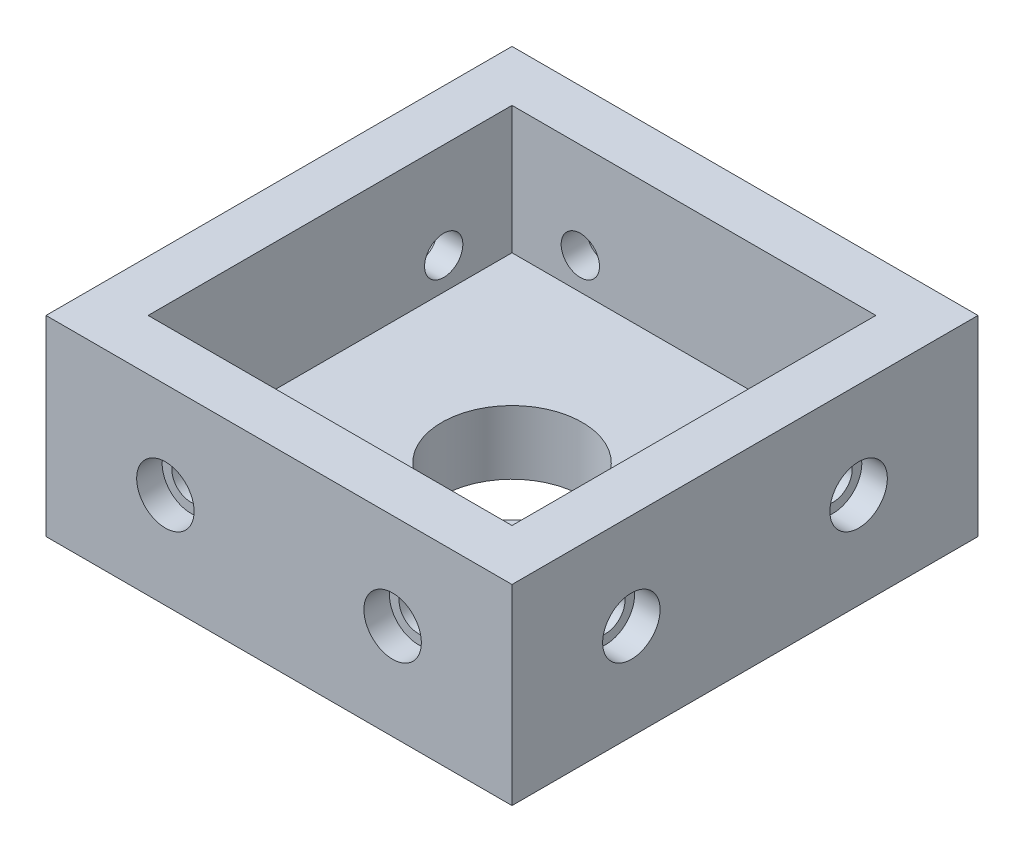
ISO-10303-21;
HEADER;
FILE_DESCRIPTION(('STEP AP214'),'2;1');
FILE_NAME('part.step','',(''),(''),'','','');
FILE_SCHEMA(('AUTOMOTIVE_DESIGN { 1 0 10303 214 1 1 1 1 }'));
ENDSEC;
DATA;
#1=APPLICATION_CONTEXT('core data for automotive mechanical design processes');
#2=APPLICATION_PROTOCOL_DEFINITION('international standard','automotive_design',2000,#1);
#3=PRODUCT_CONTEXT('',#1,'mechanical');
#4=PRODUCT('Part','Part','',(#3));
#5=PRODUCT_RELATED_PRODUCT_CATEGORY('part','',(#4));
#6=PRODUCT_DEFINITION_FORMATION('','',#4);
#7=PRODUCT_DEFINITION_CONTEXT('part definition',#1,'design');
#8=PRODUCT_DEFINITION('design','',#6,#7);
#9=PRODUCT_DEFINITION_SHAPE('','',#8);
#10=(LENGTH_UNIT() NAMED_UNIT(*) SI_UNIT(.MILLI.,.METRE.));
#11=(NAMED_UNIT(*) PLANE_ANGLE_UNIT() SI_UNIT($,.RADIAN.));
#12=(NAMED_UNIT(*) SI_UNIT($,.STERADIAN.) SOLID_ANGLE_UNIT());
#13=UNCERTAINTY_MEASURE_WITH_UNIT(LENGTH_MEASURE(1.E-05),#10,'distance_accuracy_value','');
#14=(GEOMETRIC_REPRESENTATION_CONTEXT(3) GLOBAL_UNCERTAINTY_ASSIGNED_CONTEXT((#13)) GLOBAL_UNIT_ASSIGNED_CONTEXT((#10,
#11,#12)) REPRESENTATION_CONTEXT('',''));
#15=CARTESIAN_POINT('',(0.,0.,0.));
#16=DIRECTION('',(0.,0.,1.));
#17=DIRECTION('',(1.,0.,0.));
#18=AXIS2_PLACEMENT_3D('',#15,#16,#17);
#19=CARTESIAN_POINT('',(32.5,7.50000000000001,8.9));
#20=DIRECTION('',(-1.,0.,0.));
#21=DIRECTION('',(0.,0.,1.));
#22=AXIS2_PLACEMENT_3D('',#19,#20,#21);
#23=CYLINDRICAL_SURFACE('',#22,1.5);
#24=CARTESIAN_POINT('',(28.5,7.50000000000001,8.9));
#25=DIRECTION('',(1.,0.,0.));
#26=DIRECTION('',(0.,0.,-1.));
#27=AXIS2_PLACEMENT_3D('',#24,#25,#26);
#28=CIRCLE('',#27,1.5);
#29=CARTESIAN_POINT('',(28.5,7.50000000000001,7.4));
#30=VERTEX_POINT('',#29);
#31=EDGE_CURVE('E327',#30,#30,#28,.T.);
#32=ORIENTED_EDGE('',*,*,#31,.F.);
#33=EDGE_LOOP('',(#32));
#34=FACE_BOUND('',#33,.T.);
#35=CARTESIAN_POINT('',(30.5,7.50000000000001,8.9));
#36=DIRECTION('',(1.,0.,0.));
#37=DIRECTION('',(0.,0.,-1.));
#38=AXIS2_PLACEMENT_3D('',#35,#36,#37);
#39=CIRCLE('',#38,1.5);
#40=CARTESIAN_POINT('',(30.5,7.50000000000001,7.4));
#41=VERTEX_POINT('',#40);
#42=EDGE_CURVE('E175',#41,#41,#39,.F.);
#43=ORIENTED_EDGE('',*,*,#42,.F.);
#44=EDGE_LOOP('',(#43));
#45=FACE_BOUND('',#44,.T.);
#46=ADVANCED_FACE('F171',(#34,#45),#23,.F.);
#47=CARTESIAN_POINT('',(32.5,7.50000000000001,-8.89999999999999));
#48=DIRECTION('',(-1.,0.,0.));
#49=DIRECTION('',(0.,0.,1.));
#50=AXIS2_PLACEMENT_3D('',#47,#48,#49);
#51=CYLINDRICAL_SURFACE('',#50,1.50000000000001);
#52=CARTESIAN_POINT('',(28.5,7.50000000000001,-8.89999999999999));
#53=DIRECTION('',(1.,0.,0.));
#54=DIRECTION('',(0.,0.,-1.));
#55=AXIS2_PLACEMENT_3D('',#52,#53,#54);
#56=CIRCLE('',#55,1.50000000000001);
#57=CARTESIAN_POINT('',(28.5,7.50000000000001,-10.4));
#58=VERTEX_POINT('',#57);
#59=EDGE_CURVE('E332',#58,#58,#56,.T.);
#60=ORIENTED_EDGE('',*,*,#59,.F.);
#61=EDGE_LOOP('',(#60));
#62=FACE_BOUND('',#61,.T.);
#63=CARTESIAN_POINT('',(30.5,7.50000000000001,-8.89999999999999));
#64=DIRECTION('',(1.,0.,0.));
#65=DIRECTION('',(0.,0.,-1.));
#66=AXIS2_PLACEMENT_3D('',#63,#64,#65);
#67=CIRCLE('',#66,1.50000000000001);
#68=CARTESIAN_POINT('',(30.5,7.50000000000001,-10.4));
#69=VERTEX_POINT('',#68);
#70=EDGE_CURVE('E338',#69,#69,#67,.F.);
#71=ORIENTED_EDGE('',*,*,#70,.F.);
#72=EDGE_LOOP('',(#71));
#73=FACE_BOUND('',#72,.T.);
#74=ADVANCED_FACE('F432',(#62,#73),#51,.F.);
#75=CARTESIAN_POINT('',(-4.,5.,18.25));
#76=DIRECTION('',(0.,0.,-1.));
#77=DIRECTION('',(-1.,0.,0.));
#78=AXIS2_PLACEMENT_3D('',#75,#76,#77);
#79=PLANE('',#78);
#80=CARTESIAN_POINT('',(5.34999999999997,7.50000000000001,18.25));
#81=DIRECTION('',(0.,0.,-1.));
#82=DIRECTION('',(-1.,0.,0.));
#83=AXIS2_PLACEMENT_3D('',#80,#81,#82);
#84=CIRCLE('',#83,2.25);
#85=CARTESIAN_POINT('',(3.09999999999997,7.50000000000001,18.25));
#86=VERTEX_POINT('',#85);
#87=EDGE_CURVE('E387',#86,#86,#84,.T.);
#88=ORIENTED_EDGE('',*,*,#87,.T.);
#89=EDGE_LOOP('',(#88));
#90=FACE_BOUND('',#89,.T.);
#91=DIRECTION('',(1.,0.,0.));
#92=VECTOR('',#91,1.);
#93=CARTESIAN_POINT('',(-4.,0.,18.25));
#94=LINE('',#93,#92);
#95=CARTESIAN_POINT('',(-4.,0.,18.25));
#96=VERTEX_POINT('',#95);
#97=CARTESIAN_POINT('',(32.5,0.,18.25));
#98=VERTEX_POINT('',#97);
#99=EDGE_CURVE('E296',#96,#98,#94,.T.);
#100=ORIENTED_EDGE('',*,*,#99,.T.);
#101=DIRECTION('',(0.,-1.,0.));
#102=VECTOR('',#101,1.);
#103=CARTESIAN_POINT('',(32.5,5.,18.25));
#104=LINE('',#103,#102);
#105=CARTESIAN_POINT('',(32.5,15.,18.25));
#106=VERTEX_POINT('',#105);
#107=EDGE_CURVE('E180',#106,#98,#104,.T.);
#108=ORIENTED_EDGE('',*,*,#107,.F.);
#109=DIRECTION('',(-1.,0.,0.));
#110=VECTOR('',#109,1.);
#111=CARTESIAN_POINT('',(0.,15.,18.25));
#112=LINE('',#111,#110);
#113=CARTESIAN_POINT('',(-4.,15.,18.25));
#114=VERTEX_POINT('',#113);
#115=EDGE_CURVE('E287',#106,#114,#112,.T.);
#116=ORIENTED_EDGE('',*,*,#115,.T.);
#117=DIRECTION('',(0.,-1.,0.));
#118=VECTOR('',#117,1.);
#119=CARTESIAN_POINT('',(-4.,5.,18.25));
#120=LINE('',#119,#118);
#121=EDGE_CURVE('E13',#114,#96,#120,.T.);
#122=ORIENTED_EDGE('',*,*,#121,.T.);
#123=EDGE_LOOP('',(#100,#108,#116,#122));
#124=FACE_BOUND('',#123,.T.);
#125=CARTESIAN_POINT('',(23.15,7.50000000000001,18.25));
#126=DIRECTION('',(0.,0.,-1.));
#127=DIRECTION('',(-1.,0.,0.));
#128=AXIS2_PLACEMENT_3D('',#125,#126,#127);
#129=CIRCLE('',#128,2.25);
#130=CARTESIAN_POINT('',(20.9,7.50000000000001,18.25));
#131=VERTEX_POINT('',#130);
#132=EDGE_CURVE('E376',#131,#131,#129,.T.);
#133=ORIENTED_EDGE('',*,*,#132,.T.);
#134=EDGE_LOOP('',(#133));
#135=FACE_BOUND('',#134,.T.);
#136=ADVANCED_FACE('F411',(#90,#124,#135),#79,.F.);
#137=CARTESIAN_POINT('',(5.34999999999997,7.50000000000001,18.25));
#138=DIRECTION('',(0.,0.,-1.));
#139=DIRECTION('',(-1.,0.,0.));
#140=AXIS2_PLACEMENT_3D('',#137,#138,#139);
#141=CYLINDRICAL_SURFACE('',#140,1.5);
#142=CARTESIAN_POINT('',(5.34999999999997,7.50000000000001,14.25));
#143=DIRECTION('',(0.,0.,1.));
#144=DIRECTION('',(1.,0.,0.));
#145=AXIS2_PLACEMENT_3D('',#142,#143,#144);
#146=CIRCLE('',#145,1.5);
#147=CARTESIAN_POINT('',(6.84999999999997,7.50000000000001,14.25));
#148=VERTEX_POINT('',#147);
#149=EDGE_CURVE('E313',#148,#148,#146,.T.);
#150=ORIENTED_EDGE('',*,*,#149,.F.);
#151=EDGE_LOOP('',(#150));
#152=FACE_BOUND('',#151,.T.);
#153=CARTESIAN_POINT('',(5.34999999999997,7.50000000000001,16.25));
#154=DIRECTION('',(0.,0.,1.));
#155=DIRECTION('',(1.,0.,0.));
#156=AXIS2_PLACEMENT_3D('',#153,#154,#155);
#157=CIRCLE('',#156,1.5);
#158=CARTESIAN_POINT('',(6.84999999999997,7.50000000000001,16.25));
#159=VERTEX_POINT('',#158);
#160=EDGE_CURVE('E383',#159,#159,#157,.T.);
#161=ORIENTED_EDGE('',*,*,#160,.T.);
#162=EDGE_LOOP('',(#161));
#163=FACE_BOUND('',#162,.T.);
#164=ADVANCED_FACE('F407',(#152,#163),#141,.F.);
#165=CARTESIAN_POINT('',(23.15,7.50000000000001,18.25));
#166=DIRECTION('',(0.,0.,-1.));
#167=DIRECTION('',(-1.,0.,0.));
#168=AXIS2_PLACEMENT_3D('',#165,#166,#167);
#169=CYLINDRICAL_SURFACE('',#168,1.5);
#170=CARTESIAN_POINT('',(23.15,7.50000000000001,14.25));
#171=DIRECTION('',(0.,0.,1.));
#172=DIRECTION('',(1.,0.,0.));
#173=AXIS2_PLACEMENT_3D('',#170,#171,#172);
#174=CIRCLE('',#173,1.5);
#175=CARTESIAN_POINT('',(24.65,7.50000000000001,14.25));
#176=VERTEX_POINT('',#175);
#177=EDGE_CURVE('E264',#176,#176,#174,.T.);
#178=ORIENTED_EDGE('',*,*,#177,.F.);
#179=EDGE_LOOP('',(#178));
#180=FACE_BOUND('',#179,.T.);
#181=CARTESIAN_POINT('',(23.15,7.50000000000001,16.25));
#182=DIRECTION('',(0.,0.,1.));
#183=DIRECTION('',(1.,0.,0.));
#184=AXIS2_PLACEMENT_3D('',#181,#182,#183);
#185=CIRCLE('',#184,1.5);
#186=CARTESIAN_POINT('',(24.65,7.50000000000001,16.25));
#187=VERTEX_POINT('',#186);
#188=EDGE_CURVE('E379',#187,#187,#185,.T.);
#189=ORIENTED_EDGE('',*,*,#188,.T.);
#190=EDGE_LOOP('',(#189));
#191=FACE_BOUND('',#190,.T.);
#192=ADVANCED_FACE('F410',(#180,#191),#169,.F.);
#193=CARTESIAN_POINT('',(0.,5.,0.));
#194=DIRECTION('',(0.,1.,0.));
#195=DIRECTION('',(0.,0.,1.));
#196=AXIS2_PLACEMENT_3D('',#193,#194,#195);
#197=PLANE('',#196);
#198=CARTESIAN_POINT('',(14.25,5.,0.));
#199=DIRECTION('',(0.,1.,0.));
#200=DIRECTION('',(0.,0.,1.));
#201=AXIS2_PLACEMENT_3D('',#198,#199,#200);
#202=CIRCLE('',#201,5.5);
#203=CARTESIAN_POINT('',(14.25,5.,5.5));
#204=VERTEX_POINT('',#203);
#205=EDGE_CURVE('E290',#204,#204,#202,.T.);
#206=ORIENTED_EDGE('',*,*,#205,.F.);
#207=EDGE_LOOP('',(#206));
#208=FACE_BOUND('',#207,.T.);
#209=DIRECTION('',(0.,0.,1.));
#210=VECTOR('',#209,1.);
#211=CARTESIAN_POINT('',(0.,5.,0.));
#212=LINE('',#211,#210);
#213=CARTESIAN_POINT('',(0.,5.,-14.25));
#214=VERTEX_POINT('',#213);
#215=CARTESIAN_POINT('',(0.,5.,14.25));
#216=VERTEX_POINT('',#215);
#217=EDGE_CURVE('E270',#214,#216,#212,.T.);
#218=ORIENTED_EDGE('',*,*,#217,.T.);
#219=DIRECTION('',(-1.,0.,0.));
#220=VECTOR('',#219,1.);
#221=CARTESIAN_POINT('',(0.,5.,14.25));
#222=LINE('',#221,#220);
#223=CARTESIAN_POINT('',(28.5,5.,14.25));
#224=VERTEX_POINT('',#223);
#225=EDGE_CURVE('E188',#224,#216,#222,.T.);
#226=ORIENTED_EDGE('',*,*,#225,.F.);
#227=DIRECTION('',(0.,0.,1.));
#228=VECTOR('',#227,1.);
#229=CARTESIAN_POINT('',(28.5,5.,0.));
#230=LINE('',#229,#228);
#231=CARTESIAN_POINT('',(28.5,5.,-14.25));
#232=VERTEX_POINT('',#231);
#233=EDGE_CURVE('E193',#232,#224,#230,.T.);
#234=ORIENTED_EDGE('',*,*,#233,.F.);
#235=DIRECTION('',(-1.,0.,0.));
#236=VECTOR('',#235,1.);
#237=CARTESIAN_POINT('',(0.,5.,-14.25));
#238=LINE('',#237,#236);
#239=EDGE_CURVE('E261',#232,#214,#238,.T.);
#240=ORIENTED_EDGE('',*,*,#239,.T.);
#241=EDGE_LOOP('',(#218,#226,#234,#240));
#242=FACE_BOUND('',#241,.T.);
#243=ADVANCED_FACE('F499',(#208,#242),#197,.T.);
#244=CARTESIAN_POINT('',(0.,0.,0.));
#245=DIRECTION('',(0.,1.,0.));
#246=DIRECTION('',(0.,0.,1.));
#247=AXIS2_PLACEMENT_3D('',#244,#245,#246);
#248=PLANE('',#247);
#249=DIRECTION('',(0.,0.,1.));
#250=VECTOR('',#249,1.);
#251=CARTESIAN_POINT('',(32.5,0.,-18.25));
#252=LINE('',#251,#250);
#253=CARTESIAN_POINT('',(32.5,0.,-18.25));
#254=VERTEX_POINT('',#253);
#255=EDGE_CURVE('E299',#254,#98,#252,.T.);
#256=ORIENTED_EDGE('',*,*,#255,.T.);
#257=ORIENTED_EDGE('',*,*,#99,.F.);
#258=DIRECTION('',(0.,0.,1.));
#259=VECTOR('',#258,1.);
#260=CARTESIAN_POINT('',(-4.,0.,-18.25));
#261=LINE('',#260,#259);
#262=CARTESIAN_POINT('',(-4.,0.,-18.25));
#263=VERTEX_POINT('',#262);
#264=EDGE_CURVE('E293',#263,#96,#261,.T.);
#265=ORIENTED_EDGE('',*,*,#264,.F.);
#266=DIRECTION('',(1.,0.,0.));
#267=VECTOR('',#266,1.);
#268=CARTESIAN_POINT('',(-4.,0.,-18.25));
#269=LINE('',#268,#267);
#270=EDGE_CURVE('E301',#263,#254,#269,.T.);
#271=ORIENTED_EDGE('',*,*,#270,.T.);
#272=EDGE_LOOP('',(#256,#257,#265,#271));
#273=FACE_BOUND('',#272,.T.);
#274=CARTESIAN_POINT('',(5.00000000000001,0.,0.));
#275=DIRECTION('',(0.,1.,0.));
#276=DIRECTION('',(0.,0.,1.));
#277=AXIS2_PLACEMENT_3D('',#274,#275,#276);
#278=CIRCLE('',#277,0.75);
#279=CARTESIAN_POINT('',(5.00000000000001,0.,0.75));
#280=VERTEX_POINT('',#279);
#281=EDGE_CURVE('E534',#280,#280,#278,.T.);
#282=ORIENTED_EDGE('',*,*,#281,.T.);
#283=EDGE_LOOP('',(#282));
#284=FACE_BOUND('',#283,.T.);
#285=CARTESIAN_POINT('',(14.25,0.,0.));
#286=DIRECTION('',(0.,1.,0.));
#287=DIRECTION('',(0.,0.,1.));
#288=AXIS2_PLACEMENT_3D('',#285,#286,#287);
#289=CIRCLE('',#288,5.5);
#290=CARTESIAN_POINT('',(14.25,0.,5.5));
#291=VERTEX_POINT('',#290);
#292=EDGE_CURVE('E538',#291,#291,#289,.T.);
#293=ORIENTED_EDGE('',*,*,#292,.T.);
#294=EDGE_LOOP('',(#293));
#295=FACE_BOUND('',#294,.T.);
#296=CARTESIAN_POINT('',(23.5,0.,13.2499999999999));
#297=DIRECTION('',(0.,1.,0.));
#298=DIRECTION('',(0.,0.,1.));
#299=AXIS2_PLACEMENT_3D('',#296,#297,#298);
#300=CIRCLE('',#299,0.750000000000002);
#301=CARTESIAN_POINT('',(23.5,0.,13.9999999999999));
#302=VERTEX_POINT('',#301);
#303=EDGE_CURVE('E542',#302,#302,#300,.T.);
#304=ORIENTED_EDGE('',*,*,#303,.T.);
#305=EDGE_LOOP('',(#304));
#306=FACE_BOUND('',#305,.T.);
#307=CARTESIAN_POINT('',(23.5,0.,-13.2499999999999));
#308=DIRECTION('',(0.,1.,0.));
#309=DIRECTION('',(0.,0.,1.));
#310=AXIS2_PLACEMENT_3D('',#307,#308,#309);
#311=CIRCLE('',#310,0.750000000000002);
#312=CARTESIAN_POINT('',(23.5,0.,-12.4999999999999));
#313=VERTEX_POINT('',#312);
#314=EDGE_CURVE('E545',#313,#313,#311,.T.);
#315=ORIENTED_EDGE('',*,*,#314,.T.);
#316=EDGE_LOOP('',(#315));
#317=FACE_BOUND('',#316,.T.);
#318=ADVANCED_FACE('F502',(#273,#284,#295,#306,#317),#248,.F.);
#319=CARTESIAN_POINT('',(-4.,5.,-18.25));
#320=DIRECTION('',(1.,0.,0.));
#321=DIRECTION('',(0.,0.,-1.));
#322=AXIS2_PLACEMENT_3D('',#319,#320,#321);
#323=PLANE('',#322);
#324=CARTESIAN_POINT('',(-4.,7.50000000000001,-8.89999999999998));
#325=DIRECTION('',(-1.,0.,0.));
#326=DIRECTION('',(0.,0.,1.));
#327=AXIS2_PLACEMENT_3D('',#324,#325,#326);
#328=CIRCLE('',#327,2.25);
#329=CARTESIAN_POINT('',(-4.,7.50000000000001,-6.64999999999998));
#330=VERTEX_POINT('',#329);
#331=EDGE_CURVE('E361',#330,#330,#328,.T.);
#332=ORIENTED_EDGE('',*,*,#331,.F.);
#333=EDGE_LOOP('',(#332));
#334=FACE_BOUND('',#333,.T.);
#335=CARTESIAN_POINT('',(-4.,7.50000000000001,8.90000000000001));
#336=DIRECTION('',(-1.,0.,0.));
#337=DIRECTION('',(0.,0.,1.));
#338=AXIS2_PLACEMENT_3D('',#335,#336,#337);
#339=CIRCLE('',#338,2.25);
#340=CARTESIAN_POINT('',(-4.,7.50000000000001,11.15));
#341=VERTEX_POINT('',#340);
#342=EDGE_CURVE('E364',#341,#341,#339,.T.);
#343=ORIENTED_EDGE('',*,*,#342,.F.);
#344=EDGE_LOOP('',(#343));
#345=FACE_BOUND('',#344,.T.);
#346=ORIENTED_EDGE('',*,*,#264,.T.);
#347=ORIENTED_EDGE('',*,*,#121,.F.);
#348=DIRECTION('',(0.,0.,-1.));
#349=VECTOR('',#348,1.);
#350=CARTESIAN_POINT('',(-4.,15.,0.));
#351=LINE('',#350,#349);
#352=CARTESIAN_POINT('',(-4.,15.,-18.25));
#353=VERTEX_POINT('',#352);
#354=EDGE_CURVE('E275',#114,#353,#351,.T.);
#355=ORIENTED_EDGE('',*,*,#354,.T.);
#356=DIRECTION('',(0.,-1.,0.));
#357=VECTOR('',#356,1.);
#358=CARTESIAN_POINT('',(-4.,5.,-18.25));
#359=LINE('',#358,#357);
#360=EDGE_CURVE('E304',#353,#263,#359,.T.);
#361=ORIENTED_EDGE('',*,*,#360,.T.);
#362=EDGE_LOOP('',(#346,#347,#355,#361));
#363=FACE_BOUND('',#362,.T.);
#364=ADVANCED_FACE('F173',(#334,#345,#363),#323,.F.);
#365=CARTESIAN_POINT('',(32.5,5.,-18.25));
#366=DIRECTION('',(1.,0.,0.));
#367=DIRECTION('',(0.,0.,-1.));
#368=AXIS2_PLACEMENT_3D('',#365,#366,#367);
#369=PLANE('',#368);
#370=CARTESIAN_POINT('',(32.5,7.50000000000001,-8.89999999999999));
#371=DIRECTION('',(1.,0.,0.));
#372=DIRECTION('',(0.,0.,-1.));
#373=AXIS2_PLACEMENT_3D('',#370,#371,#372);
#374=CIRCLE('',#373,2.25);
#375=CARTESIAN_POINT('',(32.5,7.50000000000001,-11.15));
#376=VERTEX_POINT('',#375);
#377=EDGE_CURVE('E346',#376,#376,#374,.T.);
#378=ORIENTED_EDGE('',*,*,#377,.F.);
#379=EDGE_LOOP('',(#378));
#380=FACE_BOUND('',#379,.T.);
#381=CARTESIAN_POINT('',(32.5,7.50000000000001,8.9));
#382=DIRECTION('',(1.,0.,0.));
#383=DIRECTION('',(0.,0.,-1.));
#384=AXIS2_PLACEMENT_3D('',#381,#382,#383);
#385=CIRCLE('',#384,2.25);
#386=CARTESIAN_POINT('',(32.5,7.50000000000001,6.65));
#387=VERTEX_POINT('',#386);
#388=EDGE_CURVE('E351',#387,#387,#385,.T.);
#389=ORIENTED_EDGE('',*,*,#388,.F.);
#390=EDGE_LOOP('',(#389));
#391=FACE_BOUND('',#390,.T.);
#392=ORIENTED_EDGE('',*,*,#255,.F.);
#393=DIRECTION('',(0.,-1.,0.));
#394=VECTOR('',#393,1.);
#395=CARTESIAN_POINT('',(32.5,5.,-18.25));
#396=LINE('',#395,#394);
#397=CARTESIAN_POINT('',(32.5,15.,-18.25));
#398=VERTEX_POINT('',#397);
#399=EDGE_CURVE('E306',#398,#254,#396,.T.);
#400=ORIENTED_EDGE('',*,*,#399,.F.);
#401=DIRECTION('',(0.,0.,-1.));
#402=VECTOR('',#401,1.);
#403=CARTESIAN_POINT('',(32.5,15.,0.));
#404=LINE('',#403,#402);
#405=EDGE_CURVE('E284',#106,#398,#404,.T.);
#406=ORIENTED_EDGE('',*,*,#405,.F.);
#407=ORIENTED_EDGE('',*,*,#107,.T.);
#408=EDGE_LOOP('',(#392,#400,#406,#407));
#409=FACE_BOUND('',#408,.T.);
#410=ADVANCED_FACE('F509',(#380,#391,#409),#369,.T.);
#411=CARTESIAN_POINT('',(-4.,5.,-18.25));
#412=DIRECTION('',(0.,0.,-1.));
#413=DIRECTION('',(-1.,0.,0.));
#414=AXIS2_PLACEMENT_3D('',#411,#412,#413);
#415=PLANE('',#414);
#416=CARTESIAN_POINT('',(23.15,7.50000000000001,-18.25));
#417=DIRECTION('',(0.,0.,-1.));
#418=DIRECTION('',(-1.,0.,0.));
#419=AXIS2_PLACEMENT_3D('',#416,#417,#418);
#420=CIRCLE('',#419,2.25);
#421=CARTESIAN_POINT('',(20.9,7.50000000000001,-18.25));
#422=VERTEX_POINT('',#421);
#423=EDGE_CURVE('E394',#422,#422,#420,.T.);
#424=ORIENTED_EDGE('',*,*,#423,.F.);
#425=EDGE_LOOP('',(#424));
#426=FACE_BOUND('',#425,.T.);
#427=CARTESIAN_POINT('',(5.34999999999997,7.50000000000001,-18.25));
#428=DIRECTION('',(0.,0.,-1.));
#429=DIRECTION('',(-1.,0.,0.));
#430=AXIS2_PLACEMENT_3D('',#427,#428,#429);
#431=CIRCLE('',#430,2.25);
#432=CARTESIAN_POINT('',(3.09999999999997,7.50000000000001,-18.25));
#433=VERTEX_POINT('',#432);
#434=EDGE_CURVE('E397',#433,#433,#431,.T.);
#435=ORIENTED_EDGE('',*,*,#434,.F.);
#436=EDGE_LOOP('',(#435));
#437=FACE_BOUND('',#436,.T.);
#438=ORIENTED_EDGE('',*,*,#270,.F.);
#439=ORIENTED_EDGE('',*,*,#360,.F.);
#440=DIRECTION('',(-1.,0.,0.));
#441=VECTOR('',#440,1.);
#442=CARTESIAN_POINT('',(0.,15.,-18.25));
#443=LINE('',#442,#441);
#444=EDGE_CURVE('E281',#398,#353,#443,.T.);
#445=ORIENTED_EDGE('',*,*,#444,.F.);
#446=ORIENTED_EDGE('',*,*,#399,.T.);
#447=EDGE_LOOP('',(#438,#439,#445,#446));
#448=FACE_BOUND('',#447,.T.);
#449=ADVANCED_FACE('F497',(#426,#437,#448),#415,.T.);
#450=CARTESIAN_POINT('',(14.25,5.,0.));
#451=DIRECTION('',(0.,-1.,0.));
#452=DIRECTION('',(0.,0.,-1.));
#453=AXIS2_PLACEMENT_3D('',#450,#451,#452);
#454=CYLINDRICAL_SURFACE('',#453,5.5);
#455=ORIENTED_EDGE('',*,*,#292,.F.);
#456=EDGE_LOOP('',(#455));
#457=FACE_BOUND('',#456,.T.);
#458=ORIENTED_EDGE('',*,*,#205,.T.);
#459=EDGE_LOOP('',(#458));
#460=FACE_BOUND('',#459,.T.);
#461=ADVANCED_FACE('F494',(#457,#460),#454,.F.);
#462=CARTESIAN_POINT('',(0.,15.,0.));
#463=DIRECTION('',(0.,1.,0.));
#464=DIRECTION('',(0.,0.,1.));
#465=AXIS2_PLACEMENT_3D('',#462,#463,#464);
#466=PLANE('',#465);
#467=DIRECTION('',(-1.,0.,0.));
#468=VECTOR('',#467,1.);
#469=CARTESIAN_POINT('',(0.,15.,14.25));
#470=LINE('',#469,#468);
#471=CARTESIAN_POINT('',(28.5,15.,14.25));
#472=VERTEX_POINT('',#471);
#473=CARTESIAN_POINT('',(0.,15.,14.25));
#474=VERTEX_POINT('',#473);
#475=EDGE_CURVE('E249',#472,#474,#470,.T.);
#476=ORIENTED_EDGE('',*,*,#475,.T.);
#477=DIRECTION('',(0.,0.,1.));
#478=VECTOR('',#477,1.);
#479=CARTESIAN_POINT('',(0.,15.,0.));
#480=LINE('',#479,#478);
#481=CARTESIAN_POINT('',(0.,15.,-14.25));
#482=VERTEX_POINT('',#481);
#483=EDGE_CURVE('E237',#482,#474,#480,.T.);
#484=ORIENTED_EDGE('',*,*,#483,.F.);
#485=DIRECTION('',(-1.,0.,0.));
#486=VECTOR('',#485,1.);
#487=CARTESIAN_POINT('',(0.,15.,-14.25));
#488=LINE('',#487,#486);
#489=CARTESIAN_POINT('',(28.5,15.,-14.25));
#490=VERTEX_POINT('',#489);
#491=EDGE_CURVE('E248',#490,#482,#488,.T.);
#492=ORIENTED_EDGE('',*,*,#491,.F.);
#493=DIRECTION('',(0.,0.,1.));
#494=VECTOR('',#493,1.);
#495=CARTESIAN_POINT('',(28.5,15.,0.));
#496=LINE('',#495,#494);
#497=EDGE_CURVE('E255',#490,#472,#496,.T.);
#498=ORIENTED_EDGE('',*,*,#497,.T.);
#499=EDGE_LOOP('',(#476,#484,#492,#498));
#500=FACE_BOUND('',#499,.T.);
#501=ORIENTED_EDGE('',*,*,#354,.F.);
#502=ORIENTED_EDGE('',*,*,#115,.F.);
#503=ORIENTED_EDGE('',*,*,#405,.T.);
#504=ORIENTED_EDGE('',*,*,#444,.T.);
#505=EDGE_LOOP('',(#501,#502,#503,#504));
#506=FACE_BOUND('',#505,.T.);
#507=ADVANCED_FACE('F257',(#500,#506),#466,.T.);
#508=CARTESIAN_POINT('',(0.,15.,14.25));
#509=DIRECTION('',(0.,0.,1.));
#510=DIRECTION('',(1.,0.,0.));
#511=AXIS2_PLACEMENT_3D('',#508,#509,#510);
#512=PLANE('',#511);
#513=ORIENTED_EDGE('',*,*,#177,.T.);
#514=EDGE_LOOP('',(#513));
#515=FACE_BOUND('',#514,.T.);
#516=ORIENTED_EDGE('',*,*,#149,.T.);
#517=EDGE_LOOP('',(#516));
#518=FACE_BOUND('',#517,.T.);
#519=ORIENTED_EDGE('',*,*,#225,.T.);
#520=DIRECTION('',(0.,-1.,0.));
#521=VECTOR('',#520,1.);
#522=CARTESIAN_POINT('',(0.,15.,14.25));
#523=LINE('',#522,#521);
#524=EDGE_CURVE('E241',#474,#216,#523,.T.);
#525=ORIENTED_EDGE('',*,*,#524,.F.);
#526=ORIENTED_EDGE('',*,*,#475,.F.);
#527=DIRECTION('',(0.,-1.,0.));
#528=VECTOR('',#527,1.);
#529=CARTESIAN_POINT('',(28.5,15.,14.25));
#530=LINE('',#529,#528);
#531=EDGE_CURVE('E273',#472,#224,#530,.T.);
#532=ORIENTED_EDGE('',*,*,#531,.T.);
#533=EDGE_LOOP('',(#519,#525,#526,#532));
#534=FACE_BOUND('',#533,.T.);
#535=ADVANCED_FACE('F253',(#515,#518,#534),#512,.F.);
#536=CARTESIAN_POINT('',(28.5,15.,0.));
#537=DIRECTION('',(1.,0.,0.));
#538=DIRECTION('',(0.,0.,-1.));
#539=AXIS2_PLACEMENT_3D('',#536,#537,#538);
#540=PLANE('',#539);
#541=ORIENTED_EDGE('',*,*,#59,.T.);
#542=EDGE_LOOP('',(#541));
#543=FACE_BOUND('',#542,.T.);
#544=ORIENTED_EDGE('',*,*,#31,.T.);
#545=EDGE_LOOP('',(#544));
#546=FACE_BOUND('',#545,.T.);
#547=ORIENTED_EDGE('',*,*,#233,.T.);
#548=ORIENTED_EDGE('',*,*,#531,.F.);
#549=ORIENTED_EDGE('',*,*,#497,.F.);
#550=DIRECTION('',(0.,-1.,0.));
#551=VECTOR('',#550,1.);
#552=CARTESIAN_POINT('',(28.5,15.,-14.25));
#553=LINE('',#552,#551);
#554=EDGE_CURVE('E276',#490,#232,#553,.T.);
#555=ORIENTED_EDGE('',*,*,#554,.T.);
#556=EDGE_LOOP('',(#547,#548,#549,#555));
#557=FACE_BOUND('',#556,.T.);
#558=ADVANCED_FACE('F483',(#543,#546,#557),#540,.F.);
#559=CARTESIAN_POINT('',(0.,15.,-14.25));
#560=DIRECTION('',(0.,0.,1.));
#561=DIRECTION('',(1.,0.,0.));
#562=AXIS2_PLACEMENT_3D('',#559,#560,#561);
#563=PLANE('',#562);
#564=CARTESIAN_POINT('',(23.15,7.50000000000001,-14.25));
#565=DIRECTION('',(0.,0.,1.));
#566=DIRECTION('',(1.,0.,0.));
#567=AXIS2_PLACEMENT_3D('',#564,#565,#566);
#568=CIRCLE('',#567,1.5);
#569=CARTESIAN_POINT('',(24.65,7.50000000000001,-14.25));
#570=VERTEX_POINT('',#569);
#571=EDGE_CURVE('E315',#570,#570,#568,.T.);
#572=ORIENTED_EDGE('',*,*,#571,.F.);
#573=EDGE_LOOP('',(#572));
#574=FACE_BOUND('',#573,.T.);
#575=CARTESIAN_POINT('',(5.34999999999997,7.50000000000001,-14.25));
#576=DIRECTION('',(0.,0.,1.));
#577=DIRECTION('',(1.,0.,0.));
#578=AXIS2_PLACEMENT_3D('',#575,#576,#577);
#579=CIRCLE('',#578,1.5);
#580=CARTESIAN_POINT('',(6.84999999999997,7.50000000000001,-14.25));
#581=VERTEX_POINT('',#580);
#582=EDGE_CURVE('E310',#581,#581,#579,.T.);
#583=ORIENTED_EDGE('',*,*,#582,.F.);
#584=EDGE_LOOP('',(#583));
#585=FACE_BOUND('',#584,.T.);
#586=ORIENTED_EDGE('',*,*,#239,.F.);
#587=ORIENTED_EDGE('',*,*,#554,.F.);
#588=ORIENTED_EDGE('',*,*,#491,.T.);
#589=DIRECTION('',(0.,-1.,0.));
#590=VECTOR('',#589,1.);
#591=CARTESIAN_POINT('',(0.,15.,-14.25));
#592=LINE('',#591,#590);
#593=EDGE_CURVE('E243',#482,#214,#592,.T.);
#594=ORIENTED_EDGE('',*,*,#593,.T.);
#595=EDGE_LOOP('',(#586,#587,#588,#594));
#596=FACE_BOUND('',#595,.T.);
#597=ADVANCED_FACE('F474',(#574,#585,#596),#563,.T.);
#598=CARTESIAN_POINT('',(0.,15.,0.));
#599=DIRECTION('',(1.,0.,0.));
#600=DIRECTION('',(0.,0.,-1.));
#601=AXIS2_PLACEMENT_3D('',#598,#599,#600);
#602=PLANE('',#601);
#603=CARTESIAN_POINT('',(0.,7.50000000000001,-8.89999999999999));
#604=DIRECTION('',(1.,0.,0.));
#605=DIRECTION('',(0.,0.,-1.));
#606=AXIS2_PLACEMENT_3D('',#603,#604,#605);
#607=CIRCLE('',#606,1.50000000000001);
#608=CARTESIAN_POINT('',(0.,7.50000000000001,-10.4));
#609=VERTEX_POINT('',#608);
#610=EDGE_CURVE('E329',#609,#609,#607,.T.);
#611=ORIENTED_EDGE('',*,*,#610,.F.);
#612=EDGE_LOOP('',(#611));
#613=FACE_BOUND('',#612,.T.);
#614=CARTESIAN_POINT('',(0.,7.50000000000001,8.9));
#615=DIRECTION('',(1.,0.,0.));
#616=DIRECTION('',(0.,0.,-1.));
#617=AXIS2_PLACEMENT_3D('',#614,#615,#616);
#618=CIRCLE('',#617,1.5);
#619=CARTESIAN_POINT('',(0.,7.50000000000001,7.40000000000001));
#620=VERTEX_POINT('',#619);
#621=EDGE_CURVE('E324',#620,#620,#618,.T.);
#622=ORIENTED_EDGE('',*,*,#621,.F.);
#623=EDGE_LOOP('',(#622));
#624=FACE_BOUND('',#623,.T.);
#625=ORIENTED_EDGE('',*,*,#217,.F.);
#626=ORIENTED_EDGE('',*,*,#593,.F.);
#627=ORIENTED_EDGE('',*,*,#483,.T.);
#628=ORIENTED_EDGE('',*,*,#524,.T.);
#629=EDGE_LOOP('',(#625,#626,#627,#628));
#630=FACE_BOUND('',#629,.T.);
#631=ADVANCED_FACE('F240',(#613,#624,#630),#602,.T.);
#632=CARTESIAN_POINT('',(5.34999999999997,7.50000000000001,-16.25));
#633=DIRECTION('',(0.,0.,1.));
#634=DIRECTION('',(1.,0.,0.));
#635=AXIS2_PLACEMENT_3D('',#632,#633,#634);
#636=CIRCLE('',#635,1.5);
#637=CARTESIAN_POINT('',(6.84999999999997,7.50000000000001,-16.25));
#638=VERTEX_POINT('',#637);
#639=EDGE_CURVE('E314',#638,#638,#636,.F.);
#640=ORIENTED_EDGE('',*,*,#639,.T.);
#641=EDGE_LOOP('',(#640));
#642=FACE_BOUND('',#641,.T.);
#643=ORIENTED_EDGE('',*,*,#582,.T.);
#644=EDGE_LOOP('',(#643));
#645=FACE_BOUND('',#644,.T.);
#646=ADVANCED_FACE('F413',(#642,#645),#141,.F.);
#647=CARTESIAN_POINT('',(23.15,7.50000000000001,-16.25));
#648=DIRECTION('',(0.,0.,1.));
#649=DIRECTION('',(1.,0.,0.));
#650=AXIS2_PLACEMENT_3D('',#647,#648,#649);
#651=CIRCLE('',#650,1.5);
#652=CARTESIAN_POINT('',(24.65,7.50000000000001,-16.25));
#653=VERTEX_POINT('',#652);
#654=EDGE_CURVE('E318',#653,#653,#651,.F.);
#655=ORIENTED_EDGE('',*,*,#654,.T.);
#656=EDGE_LOOP('',(#655));
#657=FACE_BOUND('',#656,.T.);
#658=ORIENTED_EDGE('',*,*,#571,.T.);
#659=EDGE_LOOP('',(#658));
#660=FACE_BOUND('',#659,.T.);
#661=ADVANCED_FACE('F481',(#657,#660),#169,.F.);
#662=CARTESIAN_POINT('',(0.,15.,-16.25));
#663=DIRECTION('',(0.,0.,1.));
#664=DIRECTION('',(1.,0.,0.));
#665=AXIS2_PLACEMENT_3D('',#662,#663,#664);
#666=PLANE('',#665);
#667=CARTESIAN_POINT('',(23.15,7.50000000000001,-16.25));
#668=DIRECTION('',(0.,0.,1.));
#669=DIRECTION('',(1.,0.,0.));
#670=AXIS2_PLACEMENT_3D('',#667,#668,#669);
#671=CIRCLE('',#670,2.25);
#672=CARTESIAN_POINT('',(25.4,7.50000000000001,-16.25));
#673=VERTEX_POINT('',#672);
#674=EDGE_CURVE('E321',#673,#673,#671,.F.);
#675=ORIENTED_EDGE('',*,*,#674,.T.);
#676=EDGE_LOOP('',(#675));
#677=FACE_BOUND('',#676,.T.);
#678=ORIENTED_EDGE('',*,*,#654,.F.);
#679=EDGE_LOOP('',(#678));
#680=FACE_BOUND('',#679,.T.);
#681=ADVANCED_FACE('F743',(#677,#680),#666,.F.);
#682=CARTESIAN_POINT('',(23.15,7.50000000000001,-7.88603896932107));
#683=DIRECTION('',(0.,0.,-1.));
#684=DIRECTION('',(-1.,0.,0.));
#685=AXIS2_PLACEMENT_3D('',#682,#683,#684);
#686=CYLINDRICAL_SURFACE('',#685,2.25);
#687=ORIENTED_EDGE('',*,*,#423,.T.);
#688=EDGE_LOOP('',(#687));
#689=FACE_BOUND('',#688,.T.);
#690=ORIENTED_EDGE('',*,*,#674,.F.);
#691=EDGE_LOOP('',(#690));
#692=FACE_BOUND('',#691,.T.);
#693=ADVANCED_FACE('F753',(#689,#692),#686,.F.);
#694=CARTESIAN_POINT('',(0.,15.,-16.25));
#695=DIRECTION('',(0.,0.,1.));
#696=DIRECTION('',(1.,0.,0.));
#697=AXIS2_PLACEMENT_3D('',#694,#695,#696);
#698=PLANE('',#697);
#699=CARTESIAN_POINT('',(5.34999999999997,7.50000000000001,-16.25));
#700=DIRECTION('',(0.,0.,1.));
#701=DIRECTION('',(1.,0.,0.));
#702=AXIS2_PLACEMENT_3D('',#699,#700,#701);
#703=CIRCLE('',#702,2.25);
#704=CARTESIAN_POINT('',(7.59999999999996,7.50000000000001,-16.25));
#705=VERTEX_POINT('',#704);
#706=EDGE_CURVE('E386',#705,#705,#703,.F.);
#707=ORIENTED_EDGE('',*,*,#706,.T.);
#708=EDGE_LOOP('',(#707));
#709=FACE_BOUND('',#708,.T.);
#710=ORIENTED_EDGE('',*,*,#639,.F.);
#711=EDGE_LOOP('',(#710));
#712=FACE_BOUND('',#711,.T.);
#713=ADVANCED_FACE('F447',(#709,#712),#698,.F.);
#714=CARTESIAN_POINT('',(5.34999999999997,7.50000000000001,-7.88603896932107));
#715=DIRECTION('',(0.,0.,-1.));
#716=DIRECTION('',(-1.,0.,0.));
#717=AXIS2_PLACEMENT_3D('',#714,#715,#716);
#718=CYLINDRICAL_SURFACE('',#717,2.25);
#719=ORIENTED_EDGE('',*,*,#434,.T.);
#720=EDGE_LOOP('',(#719));
#721=FACE_BOUND('',#720,.T.);
#722=ORIENTED_EDGE('',*,*,#706,.F.);
#723=EDGE_LOOP('',(#722));
#724=FACE_BOUND('',#723,.T.);
#725=ADVANCED_FACE('F438',(#721,#724),#718,.F.);
#726=CARTESIAN_POINT('',(23.15,7.50000000000001,7.88603896932107));
#727=DIRECTION('',(0.,0.,1.));
#728=DIRECTION('',(1.,0.,0.));
#729=AXIS2_PLACEMENT_3D('',#726,#727,#728);
#730=CYLINDRICAL_SURFACE('',#729,2.25);
#731=CARTESIAN_POINT('',(23.15,7.50000000000001,16.25));
#732=DIRECTION('',(0.,0.,1.));
#733=DIRECTION('',(1.,0.,0.));
#734=AXIS2_PLACEMENT_3D('',#731,#732,#733);
#735=CIRCLE('',#734,2.25);
#736=CARTESIAN_POINT('',(25.4,7.50000000000001,16.25));
#737=VERTEX_POINT('',#736);
#738=EDGE_CURVE('E380',#737,#737,#735,.T.);
#739=ORIENTED_EDGE('',*,*,#738,.F.);
#740=EDGE_LOOP('',(#739));
#741=FACE_BOUND('',#740,.T.);
#742=ORIENTED_EDGE('',*,*,#132,.F.);
#743=EDGE_LOOP('',(#742));
#744=FACE_BOUND('',#743,.T.);
#745=ADVANCED_FACE('F436',(#741,#744),#730,.F.);
#746=CARTESIAN_POINT('',(0.,15.,16.25));
#747=DIRECTION('',(0.,0.,1.));
#748=DIRECTION('',(1.,0.,0.));
#749=AXIS2_PLACEMENT_3D('',#746,#747,#748);
#750=PLANE('',#749);
#751=ORIENTED_EDGE('',*,*,#188,.F.);
#752=EDGE_LOOP('',(#751));
#753=FACE_BOUND('',#752,.T.);
#754=ORIENTED_EDGE('',*,*,#738,.T.);
#755=EDGE_LOOP('',(#754));
#756=FACE_BOUND('',#755,.T.);
#757=ADVANCED_FACE('F426',(#753,#756),#750,.T.);
#758=CARTESIAN_POINT('',(5.34999999999997,7.50000000000001,7.88603896932107));
#759=DIRECTION('',(0.,0.,1.));
#760=DIRECTION('',(1.,0.,0.));
#761=AXIS2_PLACEMENT_3D('',#758,#759,#760);
#762=CYLINDRICAL_SURFACE('',#761,2.25);
#763=CARTESIAN_POINT('',(5.34999999999997,7.50000000000001,16.25));
#764=DIRECTION('',(0.,0.,1.));
#765=DIRECTION('',(1.,0.,0.));
#766=AXIS2_PLACEMENT_3D('',#763,#764,#765);
#767=CIRCLE('',#766,2.25);
#768=CARTESIAN_POINT('',(7.59999999999996,7.50000000000001,16.25));
#769=VERTEX_POINT('',#768);
#770=EDGE_CURVE('E375',#769,#769,#767,.T.);
#771=ORIENTED_EDGE('',*,*,#770,.F.);
#772=EDGE_LOOP('',(#771));
#773=FACE_BOUND('',#772,.T.);
#774=ORIENTED_EDGE('',*,*,#87,.F.);
#775=EDGE_LOOP('',(#774));
#776=FACE_BOUND('',#775,.T.);
#777=ADVANCED_FACE('F420',(#773,#776),#762,.F.);
#778=CARTESIAN_POINT('',(0.,15.,16.25));
#779=DIRECTION('',(0.,0.,1.));
#780=DIRECTION('',(1.,0.,0.));
#781=AXIS2_PLACEMENT_3D('',#778,#779,#780);
#782=PLANE('',#781);
#783=ORIENTED_EDGE('',*,*,#160,.F.);
#784=EDGE_LOOP('',(#783));
#785=FACE_BOUND('',#784,.T.);
#786=ORIENTED_EDGE('',*,*,#770,.T.);
#787=EDGE_LOOP('',(#786));
#788=FACE_BOUND('',#787,.T.);
#789=ADVANCED_FACE('F416',(#785,#788),#782,.T.);
#790=CARTESIAN_POINT('',(-2.,7.50000000000001,8.9));
#791=DIRECTION('',(1.,0.,0.));
#792=DIRECTION('',(0.,0.,-1.));
#793=AXIS2_PLACEMENT_3D('',#790,#791,#792);
#794=CIRCLE('',#793,1.5);
#795=CARTESIAN_POINT('',(-2.,7.50000000000001,7.40000000000001));
#796=VERTEX_POINT('',#795);
#797=EDGE_CURVE('E328',#796,#796,#794,.F.);
#798=ORIENTED_EDGE('',*,*,#797,.T.);
#799=EDGE_LOOP('',(#798));
#800=FACE_BOUND('',#799,.T.);
#801=ORIENTED_EDGE('',*,*,#621,.T.);
#802=EDGE_LOOP('',(#801));
#803=FACE_BOUND('',#802,.T.);
#804=ADVANCED_FACE('F419',(#800,#803),#23,.F.);
#805=CARTESIAN_POINT('',(-2.,7.50000000000001,-8.89999999999999));
#806=DIRECTION('',(1.,0.,0.));
#807=DIRECTION('',(0.,0.,-1.));
#808=AXIS2_PLACEMENT_3D('',#805,#806,#807);
#809=CIRCLE('',#808,1.50000000000001);
#810=CARTESIAN_POINT('',(-2.,7.50000000000001,-10.4));
#811=VERTEX_POINT('',#810);
#812=EDGE_CURVE('E333',#811,#811,#809,.F.);
#813=ORIENTED_EDGE('',*,*,#812,.T.);
#814=EDGE_LOOP('',(#813));
#815=FACE_BOUND('',#814,.T.);
#816=ORIENTED_EDGE('',*,*,#610,.T.);
#817=EDGE_LOOP('',(#816));
#818=FACE_BOUND('',#817,.T.);
#819=ADVANCED_FACE('F459',(#815,#818),#51,.F.);
#820=CARTESIAN_POINT('',(-2.,15.,0.));
#821=DIRECTION('',(1.,0.,0.));
#822=DIRECTION('',(0.,0.,-1.));
#823=AXIS2_PLACEMENT_3D('',#820,#821,#822);
#824=PLANE('',#823);
#825=CARTESIAN_POINT('',(-2.,7.50000000000001,-8.89999999999998));
#826=DIRECTION('',(1.,0.,0.));
#827=DIRECTION('',(0.,0.,-1.));
#828=AXIS2_PLACEMENT_3D('',#825,#826,#827);
#829=CIRCLE('',#828,2.25);
#830=CARTESIAN_POINT('',(-2.,7.50000000000001,-11.15));
#831=VERTEX_POINT('',#830);
#832=EDGE_CURVE('E336',#831,#831,#829,.F.);
#833=ORIENTED_EDGE('',*,*,#832,.T.);
#834=EDGE_LOOP('',(#833));
#835=FACE_BOUND('',#834,.T.);
#836=ORIENTED_EDGE('',*,*,#812,.F.);
#837=EDGE_LOOP('',(#836));
#838=FACE_BOUND('',#837,.T.);
#839=ADVANCED_FACE('F467',(#835,#838),#824,.F.);
#840=CARTESIAN_POINT('',(6.36396103067894,7.50000000000001,-8.89999999999999));
#841=DIRECTION('',(-1.,0.,0.));
#842=DIRECTION('',(0.,0.,1.));
#843=AXIS2_PLACEMENT_3D('',#840,#841,#842);
#844=CYLINDRICAL_SURFACE('',#843,2.25);
#845=ORIENTED_EDGE('',*,*,#331,.T.);
#846=EDGE_LOOP('',(#845));
#847=FACE_BOUND('',#846,.T.);
#848=ORIENTED_EDGE('',*,*,#832,.F.);
#849=EDGE_LOOP('',(#848));
#850=FACE_BOUND('',#849,.T.);
#851=ADVANCED_FACE('F604',(#847,#850),#844,.F.);
#852=CARTESIAN_POINT('',(-2.,15.,0.));
#853=DIRECTION('',(1.,0.,0.));
#854=DIRECTION('',(0.,0.,-1.));
#855=AXIS2_PLACEMENT_3D('',#852,#853,#854);
#856=PLANE('',#855);
#857=CARTESIAN_POINT('',(-2.,7.50000000000001,8.90000000000001));
#858=DIRECTION('',(1.,0.,0.));
#859=DIRECTION('',(0.,0.,-1.));
#860=AXIS2_PLACEMENT_3D('',#857,#858,#859);
#861=CIRCLE('',#860,2.25);
#862=CARTESIAN_POINT('',(-2.,7.50000000000001,6.65000000000001));
#863=VERTEX_POINT('',#862);
#864=EDGE_CURVE('E344',#863,#863,#861,.F.);
#865=ORIENTED_EDGE('',*,*,#864,.T.);
#866=EDGE_LOOP('',(#865));
#867=FACE_BOUND('',#866,.T.);
#868=ORIENTED_EDGE('',*,*,#797,.F.);
#869=EDGE_LOOP('',(#868));
#870=FACE_BOUND('',#869,.T.);
#871=ADVANCED_FACE('F607',(#867,#870),#856,.F.);
#872=CARTESIAN_POINT('',(6.36396103067894,7.50000000000001,8.9));
#873=DIRECTION('',(-1.,0.,0.));
#874=DIRECTION('',(0.,0.,1.));
#875=AXIS2_PLACEMENT_3D('',#872,#873,#874);
#876=CYLINDRICAL_SURFACE('',#875,2.25);
#877=ORIENTED_EDGE('',*,*,#342,.T.);
#878=EDGE_LOOP('',(#877));
#879=FACE_BOUND('',#878,.T.);
#880=ORIENTED_EDGE('',*,*,#864,.F.);
#881=EDGE_LOOP('',(#880));
#882=FACE_BOUND('',#881,.T.);
#883=ADVANCED_FACE('F597',(#879,#882),#876,.F.);
#884=CARTESIAN_POINT('',(30.5,15.,0.));
#885=DIRECTION('',(1.,0.,0.));
#886=DIRECTION('',(0.,0.,-1.));
#887=AXIS2_PLACEMENT_3D('',#884,#885,#886);
#888=PLANE('',#887);
#889=CARTESIAN_POINT('',(30.5,7.50000000000001,-8.89999999999999));
#890=DIRECTION('',(1.,0.,0.));
#891=DIRECTION('',(0.,0.,-1.));
#892=AXIS2_PLACEMENT_3D('',#889,#890,#891);
#893=CIRCLE('',#892,2.25);
#894=CARTESIAN_POINT('',(30.5,7.50000000000001,-11.15));
#895=VERTEX_POINT('',#894);
#896=EDGE_CURVE('E340',#895,#895,#893,.F.);
#897=ORIENTED_EDGE('',*,*,#896,.F.);
#898=EDGE_LOOP('',(#897));
#899=FACE_BOUND('',#898,.T.);
#900=ORIENTED_EDGE('',*,*,#70,.T.);
#901=EDGE_LOOP('',(#900));
#902=FACE_BOUND('',#901,.T.);
#903=ADVANCED_FACE('F593',(#899,#902),#888,.T.);
#904=CARTESIAN_POINT('',(22.1360389693211,7.50000000000001,-8.89999999999999));
#905=DIRECTION('',(1.,0.,0.));
#906=DIRECTION('',(0.,0.,-1.));
#907=AXIS2_PLACEMENT_3D('',#904,#905,#906);
#908=CYLINDRICAL_SURFACE('',#907,2.25);
#909=ORIENTED_EDGE('',*,*,#896,.T.);
#910=EDGE_LOOP('',(#909));
#911=FACE_BOUND('',#910,.T.);
#912=ORIENTED_EDGE('',*,*,#377,.T.);
#913=EDGE_LOOP('',(#912));
#914=FACE_BOUND('',#913,.T.);
#915=ADVANCED_FACE('F596',(#911,#914),#908,.F.);
#916=CARTESIAN_POINT('',(30.5,15.,0.));
#917=DIRECTION('',(1.,0.,0.));
#918=DIRECTION('',(0.,0.,-1.));
#919=AXIS2_PLACEMENT_3D('',#916,#917,#918);
#920=PLANE('',#919);
#921=CARTESIAN_POINT('',(30.5,7.50000000000001,8.9));
#922=DIRECTION('',(1.,0.,0.));
#923=DIRECTION('',(0.,0.,-1.));
#924=AXIS2_PLACEMENT_3D('',#921,#922,#923);
#925=CIRCLE('',#924,2.25);
#926=CARTESIAN_POINT('',(30.5,7.50000000000001,6.65));
#927=VERTEX_POINT('',#926);
#928=EDGE_CURVE('E355',#927,#927,#925,.F.);
#929=ORIENTED_EDGE('',*,*,#928,.F.);
#930=EDGE_LOOP('',(#929));
#931=FACE_BOUND('',#930,.T.);
#932=ORIENTED_EDGE('',*,*,#42,.T.);
#933=EDGE_LOOP('',(#932));
#934=FACE_BOUND('',#933,.T.);
#935=ADVANCED_FACE('F575',(#931,#934),#920,.T.);
#936=CARTESIAN_POINT('',(22.1360389693211,7.50000000000001,8.9));
#937=DIRECTION('',(1.,0.,0.));
#938=DIRECTION('',(0.,0.,-1.));
#939=AXIS2_PLACEMENT_3D('',#936,#937,#938);
#940=CYLINDRICAL_SURFACE('',#939,2.25);
#941=ORIENTED_EDGE('',*,*,#928,.T.);
#942=EDGE_LOOP('',(#941));
#943=FACE_BOUND('',#942,.T.);
#944=ORIENTED_EDGE('',*,*,#388,.T.);
#945=EDGE_LOOP('',(#944));
#946=FACE_BOUND('',#945,.T.);
#947=ADVANCED_FACE('F567',(#943,#946),#940,.F.);
#948=CARTESIAN_POINT('',(23.5,4.,13.2499999999999));
#949=DIRECTION('',(0.,1.,0.));
#950=DIRECTION('',(0.,0.,1.));
#951=AXIS2_PLACEMENT_3D('',#948,#949,#950);
#952=PLANE('',#951);
#953=CARTESIAN_POINT('',(23.5,4.,13.2499999999999));
#954=DIRECTION('',(0.,1.,0.));
#955=DIRECTION('',(0.,0.,1.));
#956=AXIS2_PLACEMENT_3D('',#953,#954,#955);
#957=CIRCLE('',#956,0.750000000000002);
#958=CARTESIAN_POINT('',(23.5,4.,13.9999999999999));
#959=VERTEX_POINT('',#958);
#960=EDGE_CURVE('E358',#959,#959,#957,.T.);
#961=ORIENTED_EDGE('',*,*,#960,.F.);
#962=EDGE_LOOP('',(#961));
#963=FACE_BOUND('',#962,.T.);
#964=ADVANCED_FACE('F565',(#963),#952,.F.);
#965=CARTESIAN_POINT('',(23.5,4.,13.2499999999999));
#966=DIRECTION('',(0.,-1.,0.));
#967=DIRECTION('',(0.,0.,-1.));
#968=AXIS2_PLACEMENT_3D('',#965,#966,#967);
#969=CYLINDRICAL_SURFACE('',#968,0.750000000000002);
#970=ORIENTED_EDGE('',*,*,#960,.T.);
#971=EDGE_LOOP('',(#970));
#972=FACE_BOUND('',#971,.T.);
#973=ORIENTED_EDGE('',*,*,#303,.F.);
#974=EDGE_LOOP('',(#973));
#975=FACE_BOUND('',#974,.T.);
#976=ADVANCED_FACE('F562',(#972,#975),#969,.F.);
#977=CARTESIAN_POINT('',(23.5,4.,-13.2499999999999));
#978=DIRECTION('',(0.,1.,0.));
#979=DIRECTION('',(0.,0.,1.));
#980=AXIS2_PLACEMENT_3D('',#977,#978,#979);
#981=PLANE('',#980);
#982=CARTESIAN_POINT('',(23.5,4.,-13.2499999999999));
#983=DIRECTION('',(0.,1.,0.));
#984=DIRECTION('',(0.,0.,1.));
#985=AXIS2_PLACEMENT_3D('',#982,#983,#984);
#986=CIRCLE('',#985,0.750000000000002);
#987=CARTESIAN_POINT('',(23.5,4.,-12.4999999999999));
#988=VERTEX_POINT('',#987);
#989=EDGE_CURVE('E552',#988,#988,#986,.T.);
#990=ORIENTED_EDGE('',*,*,#989,.F.);
#991=EDGE_LOOP('',(#990));
#992=FACE_BOUND('',#991,.T.);
#993=ADVANCED_FACE('F573',(#992),#981,.F.);
#994=CARTESIAN_POINT('',(23.5,4.,-13.2499999999999));
#995=DIRECTION('',(0.,-1.,0.));
#996=DIRECTION('',(0.,0.,-1.));
#997=AXIS2_PLACEMENT_3D('',#994,#995,#996);
#998=CYLINDRICAL_SURFACE('',#997,0.750000000000002);
#999=ORIENTED_EDGE('',*,*,#989,.T.);
#1000=EDGE_LOOP('',(#999));
#1001=FACE_BOUND('',#1000,.T.);
#1002=ORIENTED_EDGE('',*,*,#314,.F.);
#1003=EDGE_LOOP('',(#1002));
#1004=FACE_BOUND('',#1003,.T.);
#1005=ADVANCED_FACE('F586',(#1001,#1004),#998,.F.);
#1006=CARTESIAN_POINT('',(5.00000000000001,4.,0.));
#1007=DIRECTION('',(0.,1.,0.));
#1008=DIRECTION('',(0.,0.,1.));
#1009=AXIS2_PLACEMENT_3D('',#1006,#1007,#1008);
#1010=PLANE('',#1009);
#1011=CARTESIAN_POINT('',(5.00000000000001,4.,0.));
#1012=DIRECTION('',(0.,1.,0.));
#1013=DIRECTION('',(0.,0.,1.));
#1014=AXIS2_PLACEMENT_3D('',#1011,#1012,#1013);
#1015=CIRCLE('',#1014,0.75);
#1016=CARTESIAN_POINT('',(5.00000000000001,4.,0.75));
#1017=VERTEX_POINT('',#1016);
#1018=EDGE_CURVE('E551',#1017,#1017,#1015,.T.);
#1019=ORIENTED_EDGE('',*,*,#1018,.F.);
#1020=EDGE_LOOP('',(#1019));
#1021=FACE_BOUND('',#1020,.T.);
#1022=ADVANCED_FACE('F582',(#1021),#1010,.F.);
#1023=CARTESIAN_POINT('',(5.00000000000001,4.,0.));
#1024=DIRECTION('',(0.,-1.,0.));
#1025=DIRECTION('',(0.,0.,-1.));
#1026=AXIS2_PLACEMENT_3D('',#1023,#1024,#1025);
#1027=CYLINDRICAL_SURFACE('',#1026,0.75);
#1028=ORIENTED_EDGE('',*,*,#1018,.T.);
#1029=EDGE_LOOP('',(#1028));
#1030=FACE_BOUND('',#1029,.T.);
#1031=ORIENTED_EDGE('',*,*,#281,.F.);
#1032=EDGE_LOOP('',(#1031));
#1033=FACE_BOUND('',#1032,.T.);
#1034=ADVANCED_FACE('F579',(#1030,#1033),#1027,.F.);
#1035=CLOSED_SHELL('',(#46,#74,#136,#164,#192,#243,#318,#364,#410,#449,#461,#507,#535,#558,#597,
#631,#646,#661,#681,#693,#713,#725,#745,#757,#777,#789,#804,#819,#839,#851,#871,#883,#903,#915,
#935,#947,#964,#976,#993,#1005,#1022,#1034));
#1036=MANIFOLD_SOLID_BREP('B2',#1035);
#1037=ADVANCED_BREP_SHAPE_REPRESENTATION('',(#18,#1036),#14);
#1038=SHAPE_DEFINITION_REPRESENTATION(#9,#1037);
ENDSEC;
END-ISO-10303-21;
